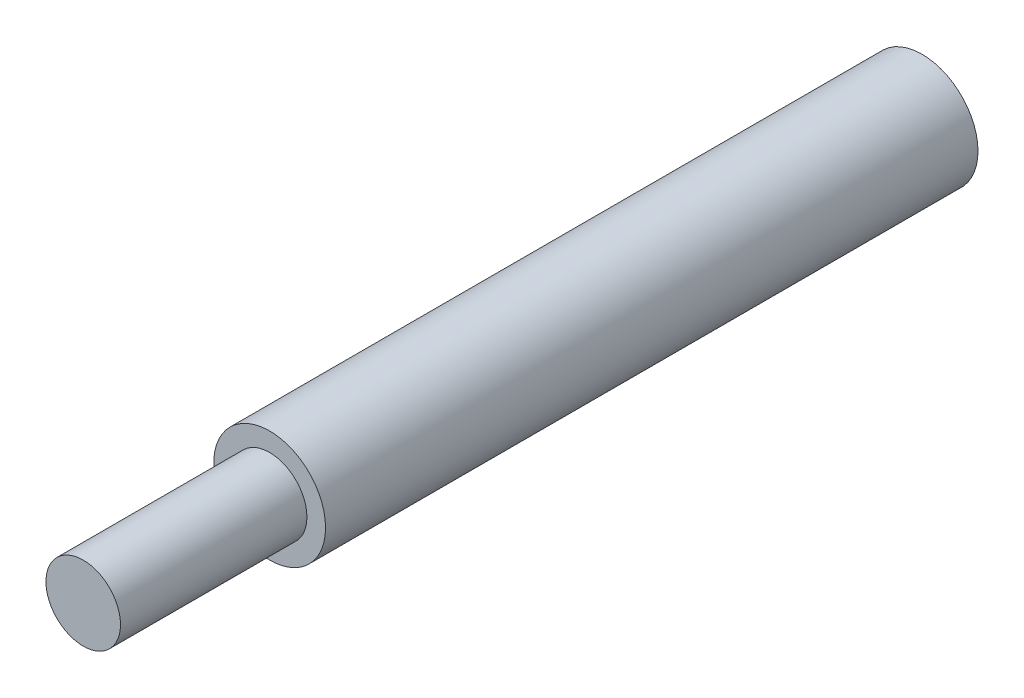
ISO-10303-21;
HEADER;
FILE_DESCRIPTION(('STEP AP214'),'2;1');
FILE_NAME('part.step','',(''),(''),'','','');
FILE_SCHEMA(('AUTOMOTIVE_DESIGN { 1 0 10303 214 1 1 1 1 }'));
ENDSEC;
DATA;
#1=APPLICATION_CONTEXT('core data for automotive mechanical design processes');
#2=APPLICATION_PROTOCOL_DEFINITION('international standard','automotive_design',2000,#1);
#3=PRODUCT_CONTEXT('',#1,'mechanical');
#4=PRODUCT('Part','Part','',(#3));
#5=PRODUCT_RELATED_PRODUCT_CATEGORY('part','',(#4));
#6=PRODUCT_DEFINITION_FORMATION('','',#4);
#7=PRODUCT_DEFINITION_CONTEXT('part definition',#1,'design');
#8=PRODUCT_DEFINITION('design','',#6,#7);
#9=PRODUCT_DEFINITION_SHAPE('','',#8);
#10=(LENGTH_UNIT() NAMED_UNIT(*) SI_UNIT(.MILLI.,.METRE.));
#11=(NAMED_UNIT(*) PLANE_ANGLE_UNIT() SI_UNIT($,.RADIAN.));
#12=(NAMED_UNIT(*) SI_UNIT($,.STERADIAN.) SOLID_ANGLE_UNIT());
#13=UNCERTAINTY_MEASURE_WITH_UNIT(LENGTH_MEASURE(1.E-05),#10,'distance_accuracy_value','');
#14=(GEOMETRIC_REPRESENTATION_CONTEXT(3) GLOBAL_UNCERTAINTY_ASSIGNED_CONTEXT((#13)) GLOBAL_UNIT_ASSIGNED_CONTEXT((#10,
#11,#12)) REPRESENTATION_CONTEXT('',''));
#15=CARTESIAN_POINT('',(0.,0.,0.));
#16=DIRECTION('',(0.,0.,1.));
#17=DIRECTION('',(1.,0.,0.));
#18=AXIS2_PLACEMENT_3D('',#15,#16,#17);
#19=CARTESIAN_POINT('',(0.,0.,70.));
#20=DIRECTION('',(0.,0.,-1.));
#21=DIRECTION('',(-1.,0.,0.));
#22=AXIS2_PLACEMENT_3D('',#19,#20,#21);
#23=CYLINDRICAL_SURFACE('',#22,6.);
#24=CARTESIAN_POINT('',(0.,0.,70.));
#25=DIRECTION('',(0.,0.,1.));
#26=DIRECTION('',(1.,0.,0.));
#27=AXIS2_PLACEMENT_3D('',#24,#25,#26);
#28=CIRCLE('',#27,6.);
#29=CARTESIAN_POINT('',(6.,0.,70.));
#30=VERTEX_POINT('',#29);
#31=EDGE_CURVE('E40',#30,#30,#28,.T.);
#32=ORIENTED_EDGE('',*,*,#31,.F.);
#33=EDGE_LOOP('',(#32));
#34=FACE_BOUND('',#33,.T.);
#35=CARTESIAN_POINT('',(0.,0.,0.));
#36=DIRECTION('',(0.,0.,1.));
#37=DIRECTION('',(1.,0.,0.));
#38=AXIS2_PLACEMENT_3D('',#35,#36,#37);
#39=CIRCLE('',#38,6.);
#40=CARTESIAN_POINT('',(6.,0.,0.));
#41=VERTEX_POINT('',#40);
#42=EDGE_CURVE('E36',#41,#41,#39,.T.);
#43=ORIENTED_EDGE('',*,*,#42,.T.);
#44=EDGE_LOOP('',(#43));
#45=FACE_BOUND('',#44,.T.);
#46=ADVANCED_FACE('F33',(#34,#45),#23,.T.);
#47=CARTESIAN_POINT('',(0.,0.,70.));
#48=DIRECTION('',(0.,0.,1.));
#49=DIRECTION('',(1.,0.,0.));
#50=AXIS2_PLACEMENT_3D('',#47,#48,#49);
#51=PLANE('',#50);
#52=CARTESIAN_POINT('',(0.,0.,70.));
#53=DIRECTION('',(0.,0.,1.));
#54=DIRECTION('',(1.,0.,0.));
#55=AXIS2_PLACEMENT_3D('',#52,#53,#54);
#56=CIRCLE('',#55,4.);
#57=CARTESIAN_POINT('',(4.,0.,70.));
#58=VERTEX_POINT('',#57);
#59=EDGE_CURVE('E10',#58,#58,#56,.T.);
#60=ORIENTED_EDGE('',*,*,#59,.F.);
#61=EDGE_LOOP('',(#60));
#62=FACE_BOUND('',#61,.T.);
#63=ORIENTED_EDGE('',*,*,#31,.T.);
#64=EDGE_LOOP('',(#63));
#65=FACE_BOUND('',#64,.T.);
#66=ADVANCED_FACE('F57',(#62,#65),#51,.T.);
#67=CARTESIAN_POINT('',(0.,0.,0.));
#68=DIRECTION('',(0.,0.,1.));
#69=DIRECTION('',(1.,0.,0.));
#70=AXIS2_PLACEMENT_3D('',#67,#68,#69);
#71=PLANE('',#70);
#72=ORIENTED_EDGE('',*,*,#42,.F.);
#73=EDGE_LOOP('',(#72));
#74=FACE_BOUND('',#73,.T.);
#75=ADVANCED_FACE('F54',(#74),#71,.F.);
#76=CARTESIAN_POINT('',(0.,0.,90.));
#77=DIRECTION('',(0.,0.,-1.));
#78=DIRECTION('',(-1.,0.,0.));
#79=AXIS2_PLACEMENT_3D('',#76,#77,#78);
#80=CYLINDRICAL_SURFACE('',#79,4.);
#81=CARTESIAN_POINT('',(0.,0.,90.));
#82=DIRECTION('',(0.,0.,1.));
#83=DIRECTION('',(1.,0.,0.));
#84=AXIS2_PLACEMENT_3D('',#81,#82,#83);
#85=CIRCLE('',#84,4.);
#86=CARTESIAN_POINT('',(4.,0.,90.));
#87=VERTEX_POINT('',#86);
#88=EDGE_CURVE('E46',#87,#87,#85,.T.);
#89=ORIENTED_EDGE('',*,*,#88,.F.);
#90=EDGE_LOOP('',(#89));
#91=FACE_BOUND('',#90,.T.);
#92=ORIENTED_EDGE('',*,*,#59,.T.);
#93=EDGE_LOOP('',(#92));
#94=FACE_BOUND('',#93,.T.);
#95=ADVANCED_FACE('F56',(#91,#94),#80,.T.);
#96=CARTESIAN_POINT('',(0.,0.,90.));
#97=DIRECTION('',(0.,0.,1.));
#98=DIRECTION('',(1.,0.,0.));
#99=AXIS2_PLACEMENT_3D('',#96,#97,#98);
#100=PLANE('',#99);
#101=ORIENTED_EDGE('',*,*,#88,.T.);
#102=EDGE_LOOP('',(#101));
#103=FACE_BOUND('',#102,.T.);
#104=ADVANCED_FACE('F62',(#103),#100,.T.);
#105=CLOSED_SHELL('',(#46,#66,#75,#95,#104));
#106=MANIFOLD_SOLID_BREP('B2',#105);
#107=ADVANCED_BREP_SHAPE_REPRESENTATION('',(#18,#106),#14);
#108=SHAPE_DEFINITION_REPRESENTATION(#9,#107);
ENDSEC;
END-ISO-10303-21;
